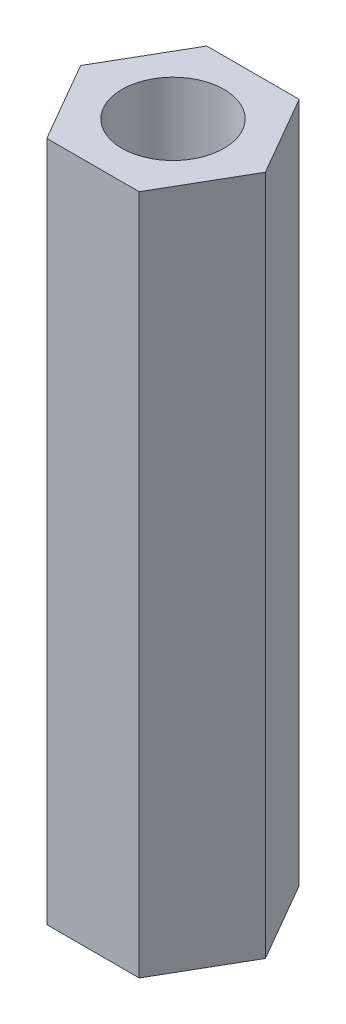
ISO-10303-21;
HEADER;
FILE_DESCRIPTION(('STEP AP214'),'2;1');
FILE_NAME('part.step','',(''),(''),'','','');
FILE_SCHEMA(('AUTOMOTIVE_DESIGN { 1 0 10303 214 1 1 1 1 }'));
ENDSEC;
DATA;
#1=APPLICATION_CONTEXT('core data for automotive mechanical design processes');
#2=APPLICATION_PROTOCOL_DEFINITION('international standard','automotive_design',2000,#1);
#3=PRODUCT_CONTEXT('',#1,'mechanical');
#4=PRODUCT('Part','Part','',(#3));
#5=PRODUCT_RELATED_PRODUCT_CATEGORY('part','',(#4));
#6=PRODUCT_DEFINITION_FORMATION('','',#4);
#7=PRODUCT_DEFINITION_CONTEXT('part definition',#1,'design');
#8=PRODUCT_DEFINITION('design','',#6,#7);
#9=PRODUCT_DEFINITION_SHAPE('','',#8);
#10=(LENGTH_UNIT() NAMED_UNIT(*) SI_UNIT(.MILLI.,.METRE.));
#11=(NAMED_UNIT(*) PLANE_ANGLE_UNIT() SI_UNIT($,.RADIAN.));
#12=(NAMED_UNIT(*) SI_UNIT($,.STERADIAN.) SOLID_ANGLE_UNIT());
#13=UNCERTAINTY_MEASURE_WITH_UNIT(LENGTH_MEASURE(1.E-05),#10,'distance_accuracy_value','');
#14=(GEOMETRIC_REPRESENTATION_CONTEXT(3) GLOBAL_UNCERTAINTY_ASSIGNED_CONTEXT((#13)) GLOBAL_UNIT_ASSIGNED_CONTEXT((#10,
#11,#12)) REPRESENTATION_CONTEXT('',''));
#15=CARTESIAN_POINT('',(0.,0.,0.));
#16=DIRECTION('',(0.,0.,1.));
#17=DIRECTION('',(1.,0.,0.));
#18=AXIS2_PLACEMENT_3D('',#15,#16,#17);
#19=CARTESIAN_POINT('',(0.,20.,0.));
#20=DIRECTION('',(0.,1.,0.));
#21=DIRECTION('',(0.,0.,1.));
#22=AXIS2_PLACEMENT_3D('',#19,#20,#21);
#23=PLANE('',#22);
#24=DIRECTION('',(0.499999999999995,0.,-0.866025403784442));
#25=VECTOR('',#24,1.);
#26=CARTESIAN_POINT('',(1.35677313259564,20.,2.34999999999997));
#27=LINE('',#26,#25);
#28=CARTESIAN_POINT('',(1.35677313259564,20.,2.34999999999997));
#29=VERTEX_POINT('',#28);
#30=CARTESIAN_POINT('',(2.71354626519123,20.,0.));
#31=VERTEX_POINT('',#30);
#32=EDGE_CURVE('E152',#29,#31,#27,.T.);
#33=ORIENTED_EDGE('',*,*,#32,.T.);
#34=DIRECTION('',(-0.500000000000001,0.,-0.866025403784438));
#35=VECTOR('',#34,1.);
#36=CARTESIAN_POINT('',(2.71354626519123,20.,0.));
#37=LINE('',#36,#35);
#38=CARTESIAN_POINT('',(1.35677313259561,20.,-2.34999999999999));
#39=VERTEX_POINT('',#38);
#40=EDGE_CURVE('E100',#31,#39,#37,.T.);
#41=ORIENTED_EDGE('',*,*,#40,.T.);
#42=DIRECTION('',(-1.,0.,0.));
#43=VECTOR('',#42,1.);
#44=CARTESIAN_POINT('',(1.35677313259561,20.,-2.34999999999999));
#45=LINE('',#44,#43);
#46=CARTESIAN_POINT('',(-1.35677313259562,20.,-2.34999999999998));
#47=VERTEX_POINT('',#46);
#48=EDGE_CURVE('E113',#39,#47,#45,.T.);
#49=ORIENTED_EDGE('',*,*,#48,.T.);
#50=DIRECTION('',(-0.499999999999995,0.,0.866025403784442));
#51=VECTOR('',#50,1.);
#52=CARTESIAN_POINT('',(-1.35677313259562,20.,-2.34999999999998));
#53=LINE('',#52,#51);
#54=CARTESIAN_POINT('',(-2.71354626519123,20.,0.));
#55=VERTEX_POINT('',#54);
#56=EDGE_CURVE('E107',#47,#55,#53,.T.);
#57=ORIENTED_EDGE('',*,*,#56,.T.);
#58=DIRECTION('',(0.500000000000007,0.,0.866025403784435));
#59=VECTOR('',#58,1.);
#60=CARTESIAN_POINT('',(-2.71354626519123,20.,0.));
#61=LINE('',#60,#59);
#62=CARTESIAN_POINT('',(-1.35677313259559,20.,2.35));
#63=VERTEX_POINT('',#62);
#64=EDGE_CURVE('E111',#55,#63,#61,.T.);
#65=ORIENTED_EDGE('',*,*,#64,.T.);
#66=DIRECTION('',(1.,0.,0.));
#67=VECTOR('',#66,1.);
#68=CARTESIAN_POINT('',(-1.35677313259559,20.,2.35));
#69=LINE('',#68,#67);
#70=EDGE_CURVE('E63',#63,#29,#69,.T.);
#71=ORIENTED_EDGE('',*,*,#70,.T.);
#72=EDGE_LOOP('',(#33,#41,#49,#57,#65,#71));
#73=FACE_BOUND('',#72,.T.);
#74=CARTESIAN_POINT('',(0.,20.,0.));
#75=DIRECTION('',(0.,1.,0.));
#76=DIRECTION('',(0.,0.,1.));
#77=AXIS2_PLACEMENT_3D('',#74,#75,#76);
#78=CIRCLE('',#77,1.5);
#79=CARTESIAN_POINT('',(0.,20.,1.5));
#80=VERTEX_POINT('',#79);
#81=EDGE_CURVE('E140',#80,#80,#78,.T.);
#82=ORIENTED_EDGE('',*,*,#81,.F.);
#83=EDGE_LOOP('',(#82));
#84=FACE_BOUND('',#83,.T.);
#85=ADVANCED_FACE('F45',(#73,#84),#23,.T.);
#86=CARTESIAN_POINT('',(0.,0.,0.));
#87=DIRECTION('',(0.,1.,0.));
#88=DIRECTION('',(0.,0.,1.));
#89=AXIS2_PLACEMENT_3D('',#86,#87,#88);
#90=PLANE('',#89);
#91=DIRECTION('',(0.499999999999995,0.,-0.866025403784442));
#92=VECTOR('',#91,1.);
#93=CARTESIAN_POINT('',(1.35677313259564,0.,2.34999999999997));
#94=LINE('',#93,#92);
#95=CARTESIAN_POINT('',(1.35677313259564,0.,2.34999999999997));
#96=VERTEX_POINT('',#95);
#97=CARTESIAN_POINT('',(2.71354626519123,0.,0.));
#98=VERTEX_POINT('',#97);
#99=EDGE_CURVE('E135',#96,#98,#94,.T.);
#100=ORIENTED_EDGE('',*,*,#99,.F.);
#101=DIRECTION('',(1.,0.,0.));
#102=VECTOR('',#101,1.);
#103=CARTESIAN_POINT('',(-1.35677313259559,0.,2.35));
#104=LINE('',#103,#102);
#105=CARTESIAN_POINT('',(-1.35677313259559,0.,2.35));
#106=VERTEX_POINT('',#105);
#107=EDGE_CURVE('E92',#106,#96,#104,.T.);
#108=ORIENTED_EDGE('',*,*,#107,.F.);
#109=DIRECTION('',(0.500000000000007,0.,0.866025403784435));
#110=VECTOR('',#109,1.);
#111=CARTESIAN_POINT('',(-2.71354626519123,0.,0.));
#112=LINE('',#111,#110);
#113=CARTESIAN_POINT('',(-2.71354626519123,0.,0.));
#114=VERTEX_POINT('',#113);
#115=EDGE_CURVE('E86',#114,#106,#112,.T.);
#116=ORIENTED_EDGE('',*,*,#115,.F.);
#117=DIRECTION('',(-0.499999999999995,0.,0.866025403784442));
#118=VECTOR('',#117,1.);
#119=CARTESIAN_POINT('',(-1.35677313259562,0.,-2.34999999999998));
#120=LINE('',#119,#118);
#121=CARTESIAN_POINT('',(-1.35677313259562,0.,-2.34999999999998));
#122=VERTEX_POINT('',#121);
#123=EDGE_CURVE('E122',#122,#114,#120,.T.);
#124=ORIENTED_EDGE('',*,*,#123,.F.);
#125=DIRECTION('',(-1.,0.,0.));
#126=VECTOR('',#125,1.);
#127=CARTESIAN_POINT('',(1.35677313259561,0.,-2.34999999999999));
#128=LINE('',#127,#126);
#129=CARTESIAN_POINT('',(1.35677313259561,0.,-2.34999999999999));
#130=VERTEX_POINT('',#129);
#131=EDGE_CURVE('E143',#130,#122,#128,.T.);
#132=ORIENTED_EDGE('',*,*,#131,.F.);
#133=DIRECTION('',(-0.500000000000001,0.,-0.866025403784438));
#134=VECTOR('',#133,1.);
#135=CARTESIAN_POINT('',(2.71354626519123,0.,0.));
#136=LINE('',#135,#134);
#137=EDGE_CURVE('E139',#98,#130,#136,.T.);
#138=ORIENTED_EDGE('',*,*,#137,.F.);
#139=EDGE_LOOP('',(#100,#108,#116,#124,#132,#138));
#140=FACE_BOUND('',#139,.T.);
#141=CARTESIAN_POINT('',(0.,0.,0.));
#142=DIRECTION('',(0.,1.,0.));
#143=DIRECTION('',(0.,0.,1.));
#144=AXIS2_PLACEMENT_3D('',#141,#142,#143);
#145=CIRCLE('',#144,1.5);
#146=CARTESIAN_POINT('',(0.,0.,1.5));
#147=VERTEX_POINT('',#146);
#148=EDGE_CURVE('E249',#147,#147,#145,.T.);
#149=ORIENTED_EDGE('',*,*,#148,.T.);
#150=EDGE_LOOP('',(#149));
#151=FACE_BOUND('',#150,.T.);
#152=ADVANCED_FACE('F165',(#140,#151),#90,.F.);
#153=CARTESIAN_POINT('',(1.35677313259564,20.,2.34999999999997));
#154=DIRECTION('',(-0.866025403784442,0.,-0.499999999999995));
#155=DIRECTION('',(-0.499999999999995,0.,0.866025403784442));
#156=AXIS2_PLACEMENT_3D('',#153,#154,#155);
#157=PLANE('',#156);
#158=ORIENTED_EDGE('',*,*,#99,.T.);
#159=DIRECTION('',(0.,-1.,0.));
#160=VECTOR('',#159,1.);
#161=CARTESIAN_POINT('',(2.71354626519123,20.,0.));
#162=LINE('',#161,#160);
#163=EDGE_CURVE('E11',#31,#98,#162,.T.);
#164=ORIENTED_EDGE('',*,*,#163,.F.);
#165=ORIENTED_EDGE('',*,*,#32,.F.);
#166=DIRECTION('',(0.,-1.,0.));
#167=VECTOR('',#166,1.);
#168=CARTESIAN_POINT('',(1.35677313259564,20.,2.34999999999997));
#169=LINE('',#168,#167);
#170=EDGE_CURVE('E131',#29,#96,#169,.T.);
#171=ORIENTED_EDGE('',*,*,#170,.T.);
#172=EDGE_LOOP('',(#158,#164,#165,#171));
#173=FACE_BOUND('',#172,.T.);
#174=ADVANCED_FACE('F47',(#173),#157,.F.);
#175=CARTESIAN_POINT('',(2.71354626519123,20.,0.));
#176=DIRECTION('',(-0.866025403784438,0.,0.500000000000001));
#177=DIRECTION('',(0.500000000000001,0.,0.866025403784438));
#178=AXIS2_PLACEMENT_3D('',#175,#176,#177);
#179=PLANE('',#178);
#180=ORIENTED_EDGE('',*,*,#137,.T.);
#181=DIRECTION('',(0.,-1.,0.));
#182=VECTOR('',#181,1.);
#183=CARTESIAN_POINT('',(1.35677313259561,20.,-2.34999999999999));
#184=LINE('',#183,#182);
#185=EDGE_CURVE('E55',#39,#130,#184,.T.);
#186=ORIENTED_EDGE('',*,*,#185,.F.);
#187=ORIENTED_EDGE('',*,*,#40,.F.);
#188=ORIENTED_EDGE('',*,*,#163,.T.);
#189=EDGE_LOOP('',(#180,#186,#187,#188));
#190=FACE_BOUND('',#189,.T.);
#191=ADVANCED_FACE('F190',(#190),#179,.F.);
#192=CARTESIAN_POINT('',(1.35677313259561,20.,-2.34999999999999));
#193=DIRECTION('',(0.,0.,1.));
#194=DIRECTION('',(1.,0.,0.));
#195=AXIS2_PLACEMENT_3D('',#192,#193,#194);
#196=PLANE('',#195);
#197=ORIENTED_EDGE('',*,*,#131,.T.);
#198=DIRECTION('',(0.,-1.,0.));
#199=VECTOR('',#198,1.);
#200=CARTESIAN_POINT('',(-1.35677313259562,20.,-2.34999999999998));
#201=LINE('',#200,#199);
#202=EDGE_CURVE('E124',#47,#122,#201,.T.);
#203=ORIENTED_EDGE('',*,*,#202,.F.);
#204=ORIENTED_EDGE('',*,*,#48,.F.);
#205=ORIENTED_EDGE('',*,*,#185,.T.);
#206=EDGE_LOOP('',(#197,#203,#204,#205));
#207=FACE_BOUND('',#206,.T.);
#208=ADVANCED_FACE('F162',(#207),#196,.F.);
#209=CARTESIAN_POINT('',(-1.35677313259562,20.,-2.34999999999998));
#210=DIRECTION('',(0.866025403784442,0.,0.499999999999995));
#211=DIRECTION('',(0.499999999999995,0.,-0.866025403784442));
#212=AXIS2_PLACEMENT_3D('',#209,#210,#211);
#213=PLANE('',#212);
#214=ORIENTED_EDGE('',*,*,#123,.T.);
#215=DIRECTION('',(0.,-1.,0.));
#216=VECTOR('',#215,1.);
#217=CARTESIAN_POINT('',(-2.71354626519123,20.,0.));
#218=LINE('',#217,#216);
#219=EDGE_CURVE('E119',#55,#114,#218,.T.);
#220=ORIENTED_EDGE('',*,*,#219,.F.);
#221=ORIENTED_EDGE('',*,*,#56,.F.);
#222=ORIENTED_EDGE('',*,*,#202,.T.);
#223=EDGE_LOOP('',(#214,#220,#221,#222));
#224=FACE_BOUND('',#223,.T.);
#225=ADVANCED_FACE('F120',(#224),#213,.F.);
#226=CARTESIAN_POINT('',(-2.71354626519123,20.,0.));
#227=DIRECTION('',(0.866025403784434,0.,-0.500000000000007));
#228=DIRECTION('',(-0.500000000000007,0.,-0.866025403784435));
#229=AXIS2_PLACEMENT_3D('',#226,#227,#228);
#230=PLANE('',#229);
#231=ORIENTED_EDGE('',*,*,#115,.T.);
#232=DIRECTION('',(0.,-1.,0.));
#233=VECTOR('',#232,1.);
#234=CARTESIAN_POINT('',(-1.35677313259559,20.,2.35));
#235=LINE('',#234,#233);
#236=EDGE_CURVE('E125',#63,#106,#235,.T.);
#237=ORIENTED_EDGE('',*,*,#236,.F.);
#238=ORIENTED_EDGE('',*,*,#64,.F.);
#239=ORIENTED_EDGE('',*,*,#219,.T.);
#240=EDGE_LOOP('',(#231,#237,#238,#239));
#241=FACE_BOUND('',#240,.T.);
#242=ADVANCED_FACE('F127',(#241),#230,.F.);
#243=CARTESIAN_POINT('',(-1.35677313259559,20.,2.35));
#244=DIRECTION('',(0.,0.,-1.));
#245=DIRECTION('',(-1.,0.,0.));
#246=AXIS2_PLACEMENT_3D('',#243,#244,#245);
#247=PLANE('',#246);
#248=ORIENTED_EDGE('',*,*,#107,.T.);
#249=ORIENTED_EDGE('',*,*,#170,.F.);
#250=ORIENTED_EDGE('',*,*,#70,.F.);
#251=ORIENTED_EDGE('',*,*,#236,.T.);
#252=EDGE_LOOP('',(#248,#249,#250,#251));
#253=FACE_BOUND('',#252,.T.);
#254=ADVANCED_FACE('F170',(#253),#247,.F.);
#255=CARTESIAN_POINT('',(0.,20.,0.));
#256=DIRECTION('',(0.,-1.,0.));
#257=DIRECTION('',(0.,0.,-1.));
#258=AXIS2_PLACEMENT_3D('',#255,#256,#257);
#259=CYLINDRICAL_SURFACE('',#258,1.5);
#260=ORIENTED_EDGE('',*,*,#81,.T.);
#261=EDGE_LOOP('',(#260));
#262=FACE_BOUND('',#261,.T.);
#263=ORIENTED_EDGE('',*,*,#148,.F.);
#264=EDGE_LOOP('',(#263));
#265=FACE_BOUND('',#264,.T.);
#266=ADVANCED_FACE('F172',(#262,#265),#259,.F.);
#267=CLOSED_SHELL('',(#85,#152,#174,#191,#208,#225,#242,#254,#266));
#268=MANIFOLD_SOLID_BREP('B2',#267);
#269=ADVANCED_BREP_SHAPE_REPRESENTATION('',(#18,#268),#14);
#270=SHAPE_DEFINITION_REPRESENTATION(#9,#269);
ENDSEC;
END-ISO-10303-21;
